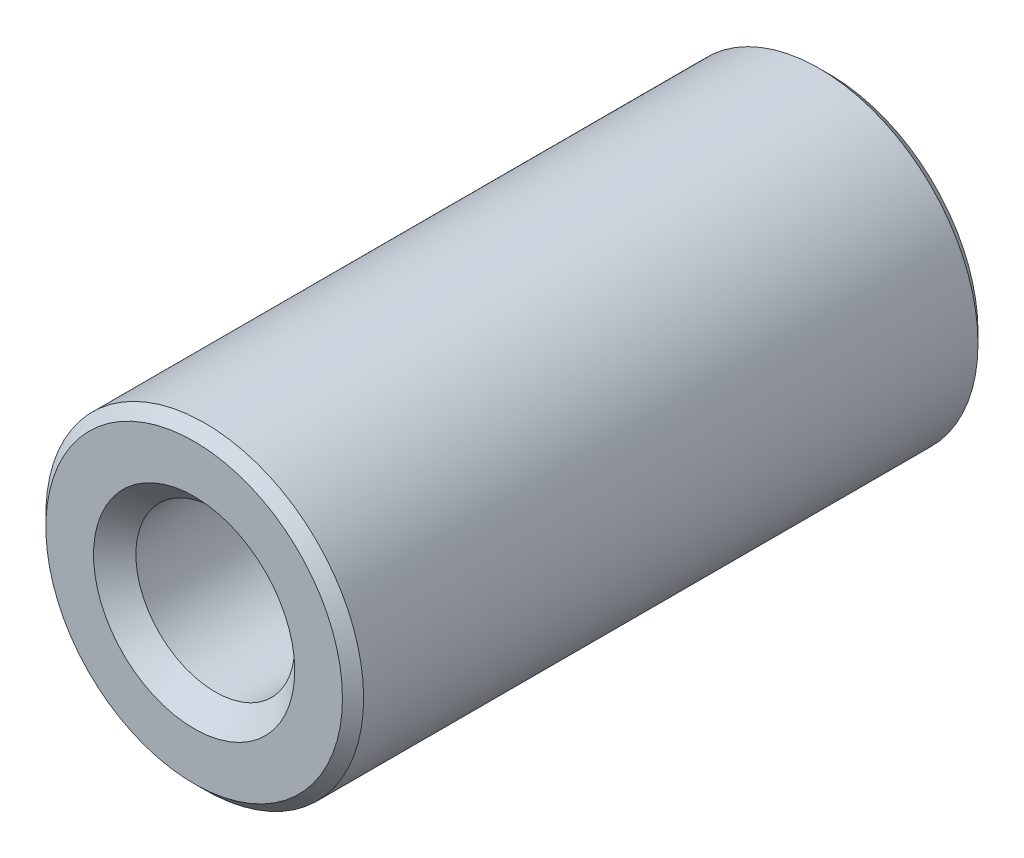
ISO-10303-21;
HEADER;
FILE_DESCRIPTION(('STEP AP214'),'2;1');
FILE_NAME('part.step','',(''),(''),'','','');
FILE_SCHEMA(('AUTOMOTIVE_DESIGN { 1 0 10303 214 1 1 1 1 }'));
ENDSEC;
DATA;
#1=APPLICATION_CONTEXT('core data for automotive mechanical design processes');
#2=APPLICATION_PROTOCOL_DEFINITION('international standard','automotive_design',2000,#1);
#3=PRODUCT_CONTEXT('',#1,'mechanical');
#4=PRODUCT('Part','Part','',(#3));
#5=PRODUCT_RELATED_PRODUCT_CATEGORY('part','',(#4));
#6=PRODUCT_DEFINITION_FORMATION('','',#4);
#7=PRODUCT_DEFINITION_CONTEXT('part definition',#1,'design');
#8=PRODUCT_DEFINITION('design','',#6,#7);
#9=PRODUCT_DEFINITION_SHAPE('','',#8);
#10=(LENGTH_UNIT() NAMED_UNIT(*) SI_UNIT(.MILLI.,.METRE.));
#11=(NAMED_UNIT(*) PLANE_ANGLE_UNIT() SI_UNIT($,.RADIAN.));
#12=(NAMED_UNIT(*) SI_UNIT($,.STERADIAN.) SOLID_ANGLE_UNIT());
#13=UNCERTAINTY_MEASURE_WITH_UNIT(LENGTH_MEASURE(1.E-05),#10,'distance_accuracy_value','');
#14=(GEOMETRIC_REPRESENTATION_CONTEXT(3) GLOBAL_UNCERTAINTY_ASSIGNED_CONTEXT((#13)) GLOBAL_UNIT_ASSIGNED_CONTEXT((#10,
#11,#12)) REPRESENTATION_CONTEXT('',''));
#15=CARTESIAN_POINT('',(0.,0.,0.));
#16=DIRECTION('',(0.,0.,1.));
#17=DIRECTION('',(1.,0.,0.));
#18=AXIS2_PLACEMENT_3D('',#15,#16,#17);
#19=CARTESIAN_POINT('',(0.,0.,-25.0030516408341));
#20=DIRECTION('',(0.,0.,1.));
#21=DIRECTION('',(1.,0.,0.));
#22=AXIS2_PLACEMENT_3D('',#19,#20,#21);
#23=CYLINDRICAL_SURFACE('',#22,1.5);
#24=CARTESIAN_POINT('',(0.,0.,17.3999407271893));
#25=DIRECTION('',(0.,0.,1.));
#26=DIRECTION('',(1.,0.,0.));
#27=AXIS2_PLACEMENT_3D('',#24,#25,#26);
#28=CIRCLE('',#27,1.5);
#29=CARTESIAN_POINT('',(1.5,0.,17.3999407271893));
#30=VERTEX_POINT('',#29);
#31=EDGE_CURVE('E65',#30,#30,#28,.T.);
#32=ORIENTED_EDGE('',*,*,#31,.T.);
#33=EDGE_LOOP('',(#32));
#34=FACE_BOUND('',#33,.T.);
#35=CARTESIAN_POINT('',(0.,0.,13.3999407271893));
#36=DIRECTION('',(0.,0.,1.));
#37=DIRECTION('',(1.,0.,0.));
#38=AXIS2_PLACEMENT_3D('',#35,#36,#37);
#39=CIRCLE('',#38,1.5);
#40=CARTESIAN_POINT('',(1.5,0.,13.3999407271893));
#41=VERTEX_POINT('',#40);
#42=EDGE_CURVE('E10',#41,#41,#39,.T.);
#43=ORIENTED_EDGE('',*,*,#42,.F.);
#44=EDGE_LOOP('',(#43));
#45=FACE_BOUND('',#44,.T.);
#46=ADVANCED_FACE('F31',(#34,#45),#23,.F.);
#47=CARTESIAN_POINT('',(0.,0.,13.));
#48=DIRECTION('',(0.,0.,-1.));
#49=DIRECTION('',(-1.,0.,0.));
#50=AXIS2_PLACEMENT_3D('',#47,#48,#49);
#51=CONICAL_SURFACE('',#50,1.89992492404044,0.785378406143493);
#52=ORIENTED_EDGE('',*,*,#42,.T.);
#53=EDGE_LOOP('',(#52));
#54=FACE_BOUND('',#53,.T.);
#55=CARTESIAN_POINT('',(0.,0.,13.));
#56=DIRECTION('',(0.,0.,1.));
#57=DIRECTION('',(1.,0.,0.));
#58=AXIS2_PLACEMENT_3D('',#55,#56,#57);
#59=CIRCLE('',#58,1.89992492404044);
#60=CARTESIAN_POINT('',(1.89992492404044,0.,13.));
#61=VERTEX_POINT('',#60);
#62=EDGE_CURVE('E37',#61,#61,#59,.T.);
#63=ORIENTED_EDGE('',*,*,#62,.F.);
#64=EDGE_LOOP('',(#63));
#65=FACE_BOUND('',#64,.T.);
#66=ADVANCED_FACE('F82',(#54,#65),#51,.F.);
#67=CARTESIAN_POINT('',(2.79996108933619,0.,13.));
#68=DIRECTION('',(0.,0.,-1.));
#69=DIRECTION('',(-1.,0.,0.));
#70=AXIS2_PLACEMENT_3D('',#67,#68,#69);
#71=PLANE('',#70);
#72=ORIENTED_EDGE('',*,*,#62,.T.);
#73=EDGE_LOOP('',(#72));
#74=FACE_BOUND('',#73,.T.);
#75=CARTESIAN_POINT('',(0.,0.,13.));
#76=DIRECTION('',(0.,0.,1.));
#77=DIRECTION('',(1.,0.,0.));
#78=AXIS2_PLACEMENT_3D('',#75,#76,#77);
#79=CIRCLE('',#78,2.79996108933619);
#80=CARTESIAN_POINT('',(2.79996108933619,0.,13.));
#81=VERTEX_POINT('',#80);
#82=EDGE_CURVE('E41',#81,#81,#79,.T.);
#83=ORIENTED_EDGE('',*,*,#82,.F.);
#84=EDGE_LOOP('',(#83));
#85=FACE_BOUND('',#84,.T.);
#86=ADVANCED_FACE('F86',(#74,#85),#71,.T.);
#87=CARTESIAN_POINT('',(0.,0.,13.2000417559428));
#88=DIRECTION('',(0.,0.,1.));
#89=DIRECTION('',(1.,0.,0.));
#90=AXIS2_PLACEMENT_3D('',#87,#88,#89);
#91=CONICAL_SURFACE('',#90,2.99999999999999,0.785391051634079);
#92=ORIENTED_EDGE('',*,*,#82,.T.);
#93=EDGE_LOOP('',(#92));
#94=FACE_BOUND('',#93,.T.);
#95=CARTESIAN_POINT('',(0.,0.,13.2000417559428));
#96=DIRECTION('',(0.,0.,1.));
#97=DIRECTION('',(1.,0.,0.));
#98=AXIS2_PLACEMENT_3D('',#95,#96,#97);
#99=CIRCLE('',#98,2.99999999999999);
#100=CARTESIAN_POINT('',(2.99999999999999,0.,13.2000417559428));
#101=VERTEX_POINT('',#100);
#102=EDGE_CURVE('E45',#101,#101,#99,.T.);
#103=ORIENTED_EDGE('',*,*,#102,.F.);
#104=EDGE_LOOP('',(#103));
#105=FACE_BOUND('',#104,.T.);
#106=ADVANCED_FACE('F90',(#94,#105),#91,.T.);
#107=CARTESIAN_POINT('',(0.,0.,-25.0030516408341));
#108=DIRECTION('',(0.,0.,1.));
#109=DIRECTION('',(1.,0.,0.));
#110=AXIS2_PLACEMENT_3D('',#107,#108,#109);
#111=CYLINDRICAL_SURFACE('',#110,2.99999999999999);
#112=ORIENTED_EDGE('',*,*,#102,.T.);
#113=EDGE_LOOP('',(#112));
#114=FACE_BOUND('',#113,.T.);
#115=CARTESIAN_POINT('',(0.,0.,24.7999245050787));
#116=DIRECTION('',(0.,0.,1.));
#117=DIRECTION('',(1.,0.,0.));
#118=AXIS2_PLACEMENT_3D('',#115,#116,#117);
#119=CIRCLE('',#118,2.99999999999999);
#120=CARTESIAN_POINT('',(2.99999999999999,0.,24.7999245050787));
#121=VERTEX_POINT('',#120);
#122=EDGE_CURVE('E50',#121,#121,#119,.T.);
#123=ORIENTED_EDGE('',*,*,#122,.F.);
#124=EDGE_LOOP('',(#123));
#125=FACE_BOUND('',#124,.T.);
#126=ADVANCED_FACE('F96',(#114,#125),#111,.T.);
#127=CARTESIAN_POINT('',(0.,0.,25.));
#128=DIRECTION('',(0.,0.,-1.));
#129=DIRECTION('',(-1.,0.,0.));
#130=AXIS2_PLACEMENT_3D('',#127,#128,#129);
#131=CONICAL_SURFACE('',#130,2.79992953986533,0.785385581022011);
#132=ORIENTED_EDGE('',*,*,#122,.T.);
#133=EDGE_LOOP('',(#132));
#134=FACE_BOUND('',#133,.T.);
#135=CARTESIAN_POINT('',(0.,0.,25.));
#136=DIRECTION('',(0.,0.,1.));
#137=DIRECTION('',(1.,0.,0.));
#138=AXIS2_PLACEMENT_3D('',#135,#136,#137);
#139=CIRCLE('',#138,2.79992953986533);
#140=CARTESIAN_POINT('',(2.79992953986533,0.,25.));
#141=VERTEX_POINT('',#140);
#142=EDGE_CURVE('E53',#141,#141,#139,.T.);
#143=ORIENTED_EDGE('',*,*,#142,.F.);
#144=EDGE_LOOP('',(#143));
#145=FACE_BOUND('',#144,.T.);
#146=ADVANCED_FACE('F100',(#134,#145),#131,.T.);
#147=CARTESIAN_POINT('',(1.89992492404044,0.,25.));
#148=DIRECTION('',(0.,0.,1.));
#149=DIRECTION('',(1.,0.,0.));
#150=AXIS2_PLACEMENT_3D('',#147,#148,#149);
#151=PLANE('',#150);
#152=ORIENTED_EDGE('',*,*,#142,.T.);
#153=EDGE_LOOP('',(#152));
#154=FACE_BOUND('',#153,.T.);
#155=CARTESIAN_POINT('',(0.,0.,25.));
#156=DIRECTION('',(0.,0.,1.));
#157=DIRECTION('',(1.,0.,0.));
#158=AXIS2_PLACEMENT_3D('',#155,#156,#157);
#159=CIRCLE('',#158,1.89992492404044);
#160=CARTESIAN_POINT('',(1.89992492404044,0.,25.));
#161=VERTEX_POINT('',#160);
#162=EDGE_CURVE('E56',#161,#161,#159,.T.);
#163=ORIENTED_EDGE('',*,*,#162,.F.);
#164=EDGE_LOOP('',(#163));
#165=FACE_BOUND('',#164,.T.);
#166=ADVANCED_FACE('F104',(#154,#165),#151,.T.);
#167=CARTESIAN_POINT('',(0.,0.,24.6000592728107));
#168=DIRECTION('',(0.,0.,1.));
#169=DIRECTION('',(1.,0.,0.));
#170=AXIS2_PLACEMENT_3D('',#167,#168,#169);
#171=CONICAL_SURFACE('',#170,1.5,0.785378406143483);
#172=ORIENTED_EDGE('',*,*,#162,.T.);
#173=EDGE_LOOP('',(#172));
#174=FACE_BOUND('',#173,.T.);
#175=CARTESIAN_POINT('',(0.,0.,24.6000592728107));
#176=DIRECTION('',(0.,0.,1.));
#177=DIRECTION('',(1.,0.,0.));
#178=AXIS2_PLACEMENT_3D('',#175,#176,#177);
#179=CIRCLE('',#178,1.5);
#180=CARTESIAN_POINT('',(1.5,0.,24.6000592728107));
#181=VERTEX_POINT('',#180);
#182=EDGE_CURVE('E59',#181,#181,#179,.T.);
#183=ORIENTED_EDGE('',*,*,#182,.F.);
#184=EDGE_LOOP('',(#183));
#185=FACE_BOUND('',#184,.T.);
#186=ADVANCED_FACE('F108',(#174,#185),#171,.F.);
#187=CARTESIAN_POINT('',(0.,0.,-25.0030516408341));
#188=DIRECTION('',(0.,0.,1.));
#189=DIRECTION('',(1.,0.,0.));
#190=AXIS2_PLACEMENT_3D('',#187,#188,#189);
#191=CYLINDRICAL_SURFACE('',#190,1.5);
#192=ORIENTED_EDGE('',*,*,#182,.T.);
#193=EDGE_LOOP('',(#192));
#194=FACE_BOUND('',#193,.T.);
#195=CARTESIAN_POINT('',(0.,0.,20.6000592728107));
#196=DIRECTION('',(0.,0.,1.));
#197=DIRECTION('',(1.,0.,0.));
#198=AXIS2_PLACEMENT_3D('',#195,#196,#197);
#199=CIRCLE('',#198,1.5);
#200=CARTESIAN_POINT('',(1.5,0.,20.6000592728107));
#201=VERTEX_POINT('',#200);
#202=EDGE_CURVE('E62',#201,#201,#199,.T.);
#203=ORIENTED_EDGE('',*,*,#202,.F.);
#204=EDGE_LOOP('',(#203));
#205=FACE_BOUND('',#204,.T.);
#206=ADVANCED_FACE('F78',(#194,#205),#191,.F.);
#207=CARTESIAN_POINT('',(0.,0.,20.6000592728107));
#208=DIRECTION('',(0.,0.,1.));
#209=DIRECTION('',(1.,0.,0.));
#210=AXIS2_PLACEMENT_3D('',#207,#208,#209);
#211=PLANE('',#210);
#212=ORIENTED_EDGE('',*,*,#202,.T.);
#213=EDGE_LOOP('',(#212));
#214=FACE_BOUND('',#213,.T.);
#215=ADVANCED_FACE('F73',(#214),#211,.T.);
#216=CARTESIAN_POINT('',(1.5,0.,17.3999407271893));
#217=DIRECTION('',(0.,0.,-1.));
#218=DIRECTION('',(-1.,0.,0.));
#219=AXIS2_PLACEMENT_3D('',#216,#217,#218);
#220=PLANE('',#219);
#221=ORIENTED_EDGE('',*,*,#31,.F.);
#222=EDGE_LOOP('',(#221));
#223=FACE_BOUND('',#222,.T.);
#224=ADVANCED_FACE('F71',(#223),#220,.T.);
#225=CLOSED_SHELL('',(#46,#66,#86,#106,#126,#146,#166,#186,#206,#215,#224));
#226=MANIFOLD_SOLID_BREP('B2',#225);
#227=ADVANCED_BREP_SHAPE_REPRESENTATION('',(#18,#226),#14);
#228=SHAPE_DEFINITION_REPRESENTATION(#9,#227);
ENDSEC;
END-ISO-10303-21;
